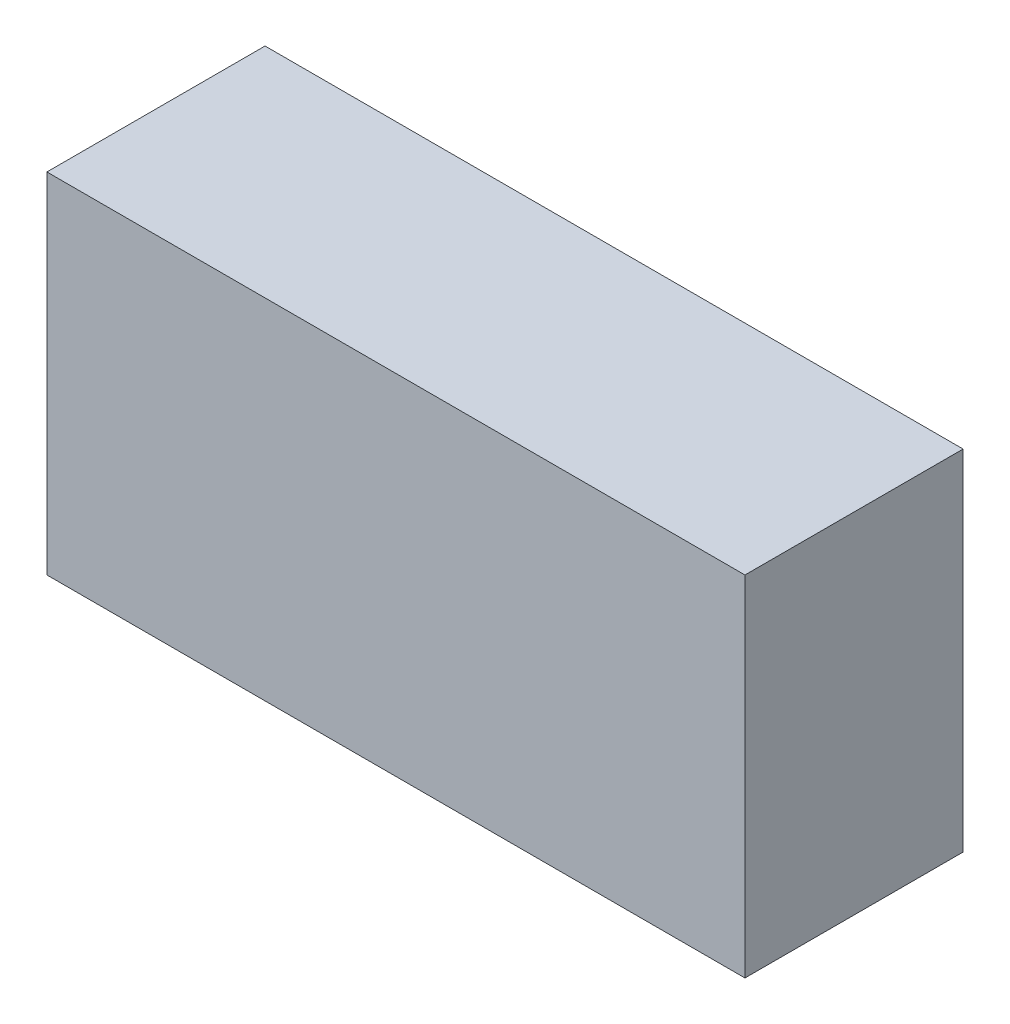
ISO-10303-21;
HEADER;
FILE_DESCRIPTION(('STEP AP214'),'2;1');
FILE_NAME('part.step','',(''),(''),'','','');
FILE_SCHEMA(('AUTOMOTIVE_DESIGN { 1 0 10303 214 1 1 1 1 }'));
ENDSEC;
DATA;
#1=APPLICATION_CONTEXT('core data for automotive mechanical design processes');
#2=APPLICATION_PROTOCOL_DEFINITION('international standard','automotive_design',2000,#1);
#3=PRODUCT_CONTEXT('',#1,'mechanical');
#4=PRODUCT('Part','Part','',(#3));
#5=PRODUCT_RELATED_PRODUCT_CATEGORY('part','',(#4));
#6=PRODUCT_DEFINITION_FORMATION('','',#4);
#7=PRODUCT_DEFINITION_CONTEXT('part definition',#1,'design');
#8=PRODUCT_DEFINITION('design','',#6,#7);
#9=PRODUCT_DEFINITION_SHAPE('','',#8);
#10=(LENGTH_UNIT() NAMED_UNIT(*) SI_UNIT(.MILLI.,.METRE.));
#11=(NAMED_UNIT(*) PLANE_ANGLE_UNIT() SI_UNIT($,.RADIAN.));
#12=(NAMED_UNIT(*) SI_UNIT($,.STERADIAN.) SOLID_ANGLE_UNIT());
#13=UNCERTAINTY_MEASURE_WITH_UNIT(LENGTH_MEASURE(1.E-05),#10,'distance_accuracy_value','');
#14=(GEOMETRIC_REPRESENTATION_CONTEXT(3) GLOBAL_UNCERTAINTY_ASSIGNED_CONTEXT((#13)) GLOBAL_UNIT_ASSIGNED_CONTEXT((#10,
#11,#12)) REPRESENTATION_CONTEXT('',''));
#15=CARTESIAN_POINT('',(0.,0.,0.));
#16=DIRECTION('',(0.,0.,1.));
#17=DIRECTION('',(1.,0.,0.));
#18=AXIS2_PLACEMENT_3D('',#15,#16,#17);
#19=CARTESIAN_POINT('',(-0.80000094,0.3999992,0.499999));
#20=DIRECTION('',(0.,0.,-1.));
#21=DIRECTION('',(-1.,0.,0.));
#22=AXIS2_PLACEMENT_3D('',#19,#20,#21);
#23=PLANE('',#22);
#24=DIRECTION('',(1.,0.,0.));
#25=VECTOR('',#24,1.);
#26=CARTESIAN_POINT('',(-0.80000094,-0.3999992,0.499999));
#27=LINE('',#26,#25);
#28=CARTESIAN_POINT('',(-0.80000094,-0.3999992,0.499999));
#29=VERTEX_POINT('',#28);
#30=CARTESIAN_POINT('',(0.80000094,-0.3999992,0.499999));
#31=VERTEX_POINT('',#30);
#32=EDGE_CURVE('E54',#29,#31,#27,.T.);
#33=ORIENTED_EDGE('',*,*,#32,.T.);
#34=DIRECTION('',(0.,1.,0.));
#35=VECTOR('',#34,1.);
#36=CARTESIAN_POINT('',(0.80000094,-0.3999992,0.499999));
#37=LINE('',#36,#35);
#38=CARTESIAN_POINT('',(0.80000094,0.3999992,0.499999));
#39=VERTEX_POINT('',#38);
#40=EDGE_CURVE('E57',#31,#39,#37,.T.);
#41=ORIENTED_EDGE('',*,*,#40,.T.);
#42=DIRECTION('',(1.,0.,0.));
#43=VECTOR('',#42,1.);
#44=CARTESIAN_POINT('',(0.80000094,0.3999992,0.499999));
#45=LINE('',#44,#43);
#46=CARTESIAN_POINT('',(-0.80000094,0.3999992,0.499999));
#47=VERTEX_POINT('',#46);
#48=EDGE_CURVE('E59',#39,#47,#45,.F.);
#49=ORIENTED_EDGE('',*,*,#48,.T.);
#50=DIRECTION('',(0.,1.,0.));
#51=VECTOR('',#50,1.);
#52=CARTESIAN_POINT('',(-0.80000094,0.3999992,0.499999));
#53=LINE('',#52,#51);
#54=EDGE_CURVE('E19',#29,#47,#53,.T.);
#55=ORIENTED_EDGE('',*,*,#54,.F.);
#56=EDGE_LOOP('',(#33,#41,#49,#55));
#57=FACE_BOUND('',#56,.T.);
#58=ADVANCED_FACE('F16',(#57),#23,.F.);
#59=CARTESIAN_POINT('',(0.80000094,0.3999992,0.));
#60=DIRECTION('',(0.,-1.,0.));
#61=DIRECTION('',(0.,0.,-1.));
#62=AXIS2_PLACEMENT_3D('',#59,#60,#61);
#63=PLANE('',#62);
#64=DIRECTION('',(0.,0.,-1.));
#65=VECTOR('',#64,1.);
#66=CARTESIAN_POINT('',(-0.80000094,0.3999992,0.));
#67=LINE('',#66,#65);
#68=CARTESIAN_POINT('',(-0.80000094,0.3999992,0.));
#69=VERTEX_POINT('',#68);
#70=EDGE_CURVE('E70',#69,#47,#67,.F.);
#71=ORIENTED_EDGE('',*,*,#70,.T.);
#72=ORIENTED_EDGE('',*,*,#48,.F.);
#73=DIRECTION('',(0.,0.,1.));
#74=VECTOR('',#73,1.);
#75=CARTESIAN_POINT('',(0.80000094,0.3999992,0.));
#76=LINE('',#75,#74);
#77=CARTESIAN_POINT('',(0.80000094,0.3999992,0.));
#78=VERTEX_POINT('',#77);
#79=EDGE_CURVE('E64',#39,#78,#76,.F.);
#80=ORIENTED_EDGE('',*,*,#79,.T.);
#81=DIRECTION('',(-1.,0.,0.));
#82=VECTOR('',#81,1.);
#83=CARTESIAN_POINT('',(-0.80000094,0.3999992,0.));
#84=LINE('',#83,#82);
#85=EDGE_CURVE('E82',#69,#78,#84,.F.);
#86=ORIENTED_EDGE('',*,*,#85,.F.);
#87=EDGE_LOOP('',(#71,#72,#80,#86));
#88=FACE_BOUND('',#87,.T.);
#89=ADVANCED_FACE('F67',(#88),#63,.F.);
#90=CARTESIAN_POINT('',(0.80000094,-0.3999992,0.));
#91=DIRECTION('',(-1.,0.,0.));
#92=DIRECTION('',(0.,0.,1.));
#93=AXIS2_PLACEMENT_3D('',#90,#91,#92);
#94=PLANE('',#93);
#95=ORIENTED_EDGE('',*,*,#79,.F.);
#96=ORIENTED_EDGE('',*,*,#40,.F.);
#97=DIRECTION('',(0.,0.,1.));
#98=VECTOR('',#97,1.);
#99=CARTESIAN_POINT('',(0.80000094,-0.3999992,0.));
#100=LINE('',#99,#98);
#101=CARTESIAN_POINT('',(0.80000094,-0.3999992,0.));
#102=VERTEX_POINT('',#101);
#103=EDGE_CURVE('E76',#31,#102,#100,.F.);
#104=ORIENTED_EDGE('',*,*,#103,.T.);
#105=DIRECTION('',(0.,1.,0.));
#106=VECTOR('',#105,1.);
#107=CARTESIAN_POINT('',(0.80000094,0.3999992,0.));
#108=LINE('',#107,#106);
#109=EDGE_CURVE('E73',#78,#102,#108,.F.);
#110=ORIENTED_EDGE('',*,*,#109,.F.);
#111=EDGE_LOOP('',(#95,#96,#104,#110));
#112=FACE_BOUND('',#111,.T.);
#113=ADVANCED_FACE('F71',(#112),#94,.F.);
#114=CARTESIAN_POINT('',(-0.80000094,-0.3999992,0.));
#115=DIRECTION('',(0.,1.,0.));
#116=DIRECTION('',(0.,0.,1.));
#117=AXIS2_PLACEMENT_3D('',#114,#115,#116);
#118=PLANE('',#117);
#119=ORIENTED_EDGE('',*,*,#103,.F.);
#120=ORIENTED_EDGE('',*,*,#32,.F.);
#121=DIRECTION('',(0.,0.,-1.));
#122=VECTOR('',#121,1.);
#123=CARTESIAN_POINT('',(-0.80000094,-0.3999992,0.));
#124=LINE('',#123,#122);
#125=CARTESIAN_POINT('',(-0.80000094,-0.3999992,0.));
#126=VERTEX_POINT('',#125);
#127=EDGE_CURVE('E34',#29,#126,#124,.T.);
#128=ORIENTED_EDGE('',*,*,#127,.T.);
#129=DIRECTION('',(-1.,0.,0.));
#130=VECTOR('',#129,1.);
#131=CARTESIAN_POINT('',(-0.80000094,-0.3999992,0.));
#132=LINE('',#131,#130);
#133=EDGE_CURVE('E25',#102,#126,#132,.T.);
#134=ORIENTED_EDGE('',*,*,#133,.F.);
#135=EDGE_LOOP('',(#119,#120,#128,#134));
#136=FACE_BOUND('',#135,.T.);
#137=ADVANCED_FACE('F88',(#136),#118,.F.);
#138=CARTESIAN_POINT('',(-0.80000094,0.3999992,0.));
#139=DIRECTION('',(1.,0.,0.));
#140=DIRECTION('',(0.,0.,-1.));
#141=AXIS2_PLACEMENT_3D('',#138,#139,#140);
#142=PLANE('',#141);
#143=ORIENTED_EDGE('',*,*,#127,.F.);
#144=ORIENTED_EDGE('',*,*,#54,.T.);
#145=ORIENTED_EDGE('',*,*,#70,.F.);
#146=DIRECTION('',(0.,1.,0.));
#147=VECTOR('',#146,1.);
#148=CARTESIAN_POINT('',(-0.80000094,0.3999992,0.));
#149=LINE('',#148,#147);
#150=EDGE_CURVE('E11',#126,#69,#149,.T.);
#151=ORIENTED_EDGE('',*,*,#150,.F.);
#152=EDGE_LOOP('',(#143,#144,#145,#151));
#153=FACE_BOUND('',#152,.T.);
#154=ADVANCED_FACE('F90',(#153),#142,.F.);
#155=CARTESIAN_POINT('',(-0.80000094,0.3999992,0.));
#156=DIRECTION('',(0.,0.,-1.));
#157=DIRECTION('',(-1.,0.,0.));
#158=AXIS2_PLACEMENT_3D('',#155,#156,#157);
#159=PLANE('',#158);
#160=ORIENTED_EDGE('',*,*,#133,.T.);
#161=ORIENTED_EDGE('',*,*,#150,.T.);
#162=ORIENTED_EDGE('',*,*,#85,.T.);
#163=ORIENTED_EDGE('',*,*,#109,.T.);
#164=EDGE_LOOP('',(#160,#161,#162,#163));
#165=FACE_BOUND('',#164,.T.);
#166=ADVANCED_FACE('F87',(#165),#159,.T.);
#167=CLOSED_SHELL('',(#58,#89,#113,#137,#154,#166));
#168=MANIFOLD_SOLID_BREP('B1',#167);
#169=ADVANCED_BREP_SHAPE_REPRESENTATION('',(#18,#168),#14);
#170=SHAPE_DEFINITION_REPRESENTATION(#9,#169);
ENDSEC;
END-ISO-10303-21;
